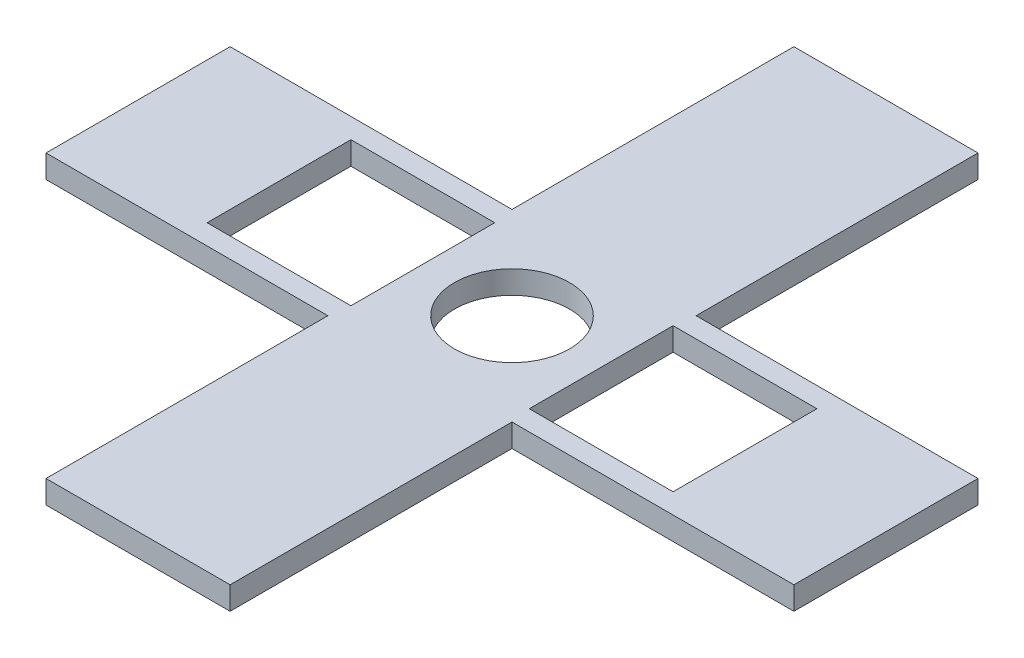
ISO-10303-21;
HEADER;
FILE_DESCRIPTION(('STEP AP214'),'2;1');
FILE_NAME('part.step','',(''),(''),'','','');
FILE_SCHEMA(('AUTOMOTIVE_DESIGN { 1 0 10303 214 1 1 1 1 }'));
ENDSEC;
DATA;
#1=APPLICATION_CONTEXT('core data for automotive mechanical design processes');
#2=APPLICATION_PROTOCOL_DEFINITION('international standard','automotive_design',2000,#1);
#3=PRODUCT_CONTEXT('',#1,'mechanical');
#4=PRODUCT('Part','Part','',(#3));
#5=PRODUCT_RELATED_PRODUCT_CATEGORY('part','',(#4));
#6=PRODUCT_DEFINITION_FORMATION('','',#4);
#7=PRODUCT_DEFINITION_CONTEXT('part definition',#1,'design');
#8=PRODUCT_DEFINITION('design','',#6,#7);
#9=PRODUCT_DEFINITION_SHAPE('','',#8);
#10=(LENGTH_UNIT() NAMED_UNIT(*) SI_UNIT(.MILLI.,.METRE.));
#11=(NAMED_UNIT(*) PLANE_ANGLE_UNIT() SI_UNIT($,.RADIAN.));
#12=(NAMED_UNIT(*) SI_UNIT($,.STERADIAN.) SOLID_ANGLE_UNIT());
#13=UNCERTAINTY_MEASURE_WITH_UNIT(LENGTH_MEASURE(1.E-05),#10,'distance_accuracy_value','');
#14=(GEOMETRIC_REPRESENTATION_CONTEXT(3) GLOBAL_UNCERTAINTY_ASSIGNED_CONTEXT((#13)) GLOBAL_UNIT_ASSIGNED_CONTEXT((#10,
#11,#12)) REPRESENTATION_CONTEXT('',''));
#15=CARTESIAN_POINT('',(0.,0.,0.));
#16=DIRECTION('',(0.,0.,1.));
#17=DIRECTION('',(1.,0.,0.));
#18=AXIS2_PLACEMENT_3D('',#15,#16,#17);
#19=CARTESIAN_POINT('',(0.,1.27,0.));
#20=DIRECTION('',(0.,1.,0.));
#21=DIRECTION('',(0.,0.,1.));
#22=AXIS2_PLACEMENT_3D('',#19,#20,#21);
#23=PLANE('',#22);
#24=DIRECTION('',(0.,0.,-1.));
#25=VECTOR('',#24,1.);
#26=CARTESIAN_POINT('',(20.6375,1.27,-5.08));
#27=LINE('',#26,#25);
#28=CARTESIAN_POINT('',(20.6375,1.27,5.08));
#29=VERTEX_POINT('',#28);
#30=CARTESIAN_POINT('',(20.6375,1.27,-5.08));
#31=VERTEX_POINT('',#30);
#32=EDGE_CURVE('E243',#29,#31,#27,.T.);
#33=ORIENTED_EDGE('',*,*,#32,.T.);
#34=DIRECTION('',(-1.,0.,0.));
#35=VECTOR('',#34,1.);
#36=CARTESIAN_POINT('',(5.08,1.27,-5.08));
#37=LINE('',#36,#35);
#38=CARTESIAN_POINT('',(5.08,1.27,-5.08));
#39=VERTEX_POINT('',#38);
#40=EDGE_CURVE('E246',#31,#39,#37,.T.);
#41=ORIENTED_EDGE('',*,*,#40,.T.);
#42=DIRECTION('',(0.,0.,-1.));
#43=VECTOR('',#42,1.);
#44=CARTESIAN_POINT('',(5.08,1.27,-20.6375));
#45=LINE('',#44,#43);
#46=CARTESIAN_POINT('',(5.08,1.27,-20.6375));
#47=VERTEX_POINT('',#46);
#48=EDGE_CURVE('E249',#39,#47,#45,.T.);
#49=ORIENTED_EDGE('',*,*,#48,.T.);
#50=DIRECTION('',(-1.,0.,0.));
#51=VECTOR('',#50,1.);
#52=CARTESIAN_POINT('',(-5.08,1.27,-20.6375));
#53=LINE('',#52,#51);
#54=CARTESIAN_POINT('',(-5.08,1.27,-20.6375));
#55=VERTEX_POINT('',#54);
#56=EDGE_CURVE('E251',#47,#55,#53,.T.);
#57=ORIENTED_EDGE('',*,*,#56,.T.);
#58=DIRECTION('',(0.,0.,1.));
#59=VECTOR('',#58,1.);
#60=CARTESIAN_POINT('',(-5.08,1.27,-20.6375));
#61=LINE('',#60,#59);
#62=CARTESIAN_POINT('',(-5.08,1.27,-5.08));
#63=VERTEX_POINT('',#62);
#64=EDGE_CURVE('E253',#55,#63,#61,.T.);
#65=ORIENTED_EDGE('',*,*,#64,.T.);
#66=DIRECTION('',(-1.,0.,0.));
#67=VECTOR('',#66,1.);
#68=CARTESIAN_POINT('',(-20.6375,1.27,-5.08));
#69=LINE('',#68,#67);
#70=CARTESIAN_POINT('',(-20.6375,1.27,-5.08));
#71=VERTEX_POINT('',#70);
#72=EDGE_CURVE('E255',#63,#71,#69,.T.);
#73=ORIENTED_EDGE('',*,*,#72,.T.);
#74=DIRECTION('',(0.,0.,1.));
#75=VECTOR('',#74,1.);
#76=CARTESIAN_POINT('',(-20.6375,1.27,-5.08));
#77=LINE('',#76,#75);
#78=CARTESIAN_POINT('',(-20.6375,1.27,5.08));
#79=VERTEX_POINT('',#78);
#80=EDGE_CURVE('E257',#71,#79,#77,.T.);
#81=ORIENTED_EDGE('',*,*,#80,.T.);
#82=DIRECTION('',(1.,0.,0.));
#83=VECTOR('',#82,1.);
#84=CARTESIAN_POINT('',(-20.6375,1.27,5.08));
#85=LINE('',#84,#83);
#86=CARTESIAN_POINT('',(-5.08,1.27,5.08));
#87=VERTEX_POINT('',#86);
#88=EDGE_CURVE('E259',#79,#87,#85,.T.);
#89=ORIENTED_EDGE('',*,*,#88,.T.);
#90=DIRECTION('',(0.,0.,1.));
#91=VECTOR('',#90,1.);
#92=CARTESIAN_POINT('',(-5.08,1.27,5.08));
#93=LINE('',#92,#91);
#94=CARTESIAN_POINT('',(-5.08,1.27,20.6375));
#95=VERTEX_POINT('',#94);
#96=EDGE_CURVE('E261',#87,#95,#93,.T.);
#97=ORIENTED_EDGE('',*,*,#96,.T.);
#98=DIRECTION('',(1.,0.,0.));
#99=VECTOR('',#98,1.);
#100=CARTESIAN_POINT('',(-5.08,1.27,20.6375));
#101=LINE('',#100,#99);
#102=CARTESIAN_POINT('',(5.08,1.27,20.6375));
#103=VERTEX_POINT('',#102);
#104=EDGE_CURVE('E263',#95,#103,#101,.T.);
#105=ORIENTED_EDGE('',*,*,#104,.T.);
#106=DIRECTION('',(0.,0.,-1.));
#107=VECTOR('',#106,1.);
#108=CARTESIAN_POINT('',(5.08,1.27,5.08));
#109=LINE('',#108,#107);
#110=CARTESIAN_POINT('',(5.08,1.27,5.08));
#111=VERTEX_POINT('',#110);
#112=EDGE_CURVE('E265',#103,#111,#109,.T.);
#113=ORIENTED_EDGE('',*,*,#112,.T.);
#114=DIRECTION('',(1.,0.,0.));
#115=VECTOR('',#114,1.);
#116=CARTESIAN_POINT('',(5.08,1.27,5.08));
#117=LINE('',#116,#115);
#118=EDGE_CURVE('E267',#111,#29,#117,.T.);
#119=ORIENTED_EDGE('',*,*,#118,.T.);
#120=EDGE_LOOP('',(#33,#41,#49,#57,#65,#73,#81,#89,#97,#105,#113,#119));
#121=FACE_BOUND('',#120,.T.);
#122=CARTESIAN_POINT('',(0.,1.27,0.));
#123=DIRECTION('',(0.,1.,0.));
#124=DIRECTION('',(0.,0.,1.));
#125=AXIS2_PLACEMENT_3D('',#122,#123,#124);
#126=CIRCLE('',#125,3.175);
#127=CARTESIAN_POINT('',(0.,1.27,3.175));
#128=VERTEX_POINT('',#127);
#129=EDGE_CURVE('E237',#128,#128,#126,.T.);
#130=ORIENTED_EDGE('',*,*,#129,.F.);
#131=EDGE_LOOP('',(#130));
#132=FACE_BOUND('',#131,.T.);
#133=DIRECTION('',(-1.,0.,0.));
#134=VECTOR('',#133,1.);
#135=CARTESIAN_POINT('',(-12.85875,1.27,-3.96875));
#136=LINE('',#135,#134);
#137=CARTESIAN_POINT('',(-4.92125,1.27,-3.96875));
#138=VERTEX_POINT('',#137);
#139=CARTESIAN_POINT('',(-12.85875,1.27,-3.96875));
#140=VERTEX_POINT('',#139);
#141=EDGE_CURVE('E208',#138,#140,#136,.T.);
#142=ORIENTED_EDGE('',*,*,#141,.F.);
#143=DIRECTION('',(0.,0.,-1.));
#144=VECTOR('',#143,1.);
#145=CARTESIAN_POINT('',(-4.92125,1.27,-3.96875));
#146=LINE('',#145,#144);
#147=CARTESIAN_POINT('',(-4.92125,1.27,3.96875));
#148=VERTEX_POINT('',#147);
#149=EDGE_CURVE('E206',#148,#138,#146,.T.);
#150=ORIENTED_EDGE('',*,*,#149,.F.);
#151=DIRECTION('',(1.,0.,0.));
#152=VECTOR('',#151,1.);
#153=CARTESIAN_POINT('',(-12.85875,1.27,3.96875));
#154=LINE('',#153,#152);
#155=CARTESIAN_POINT('',(-12.85875,1.27,3.96875));
#156=VERTEX_POINT('',#155);
#157=EDGE_CURVE('E214',#156,#148,#154,.T.);
#158=ORIENTED_EDGE('',*,*,#157,.F.);
#159=DIRECTION('',(0.,0.,1.));
#160=VECTOR('',#159,1.);
#161=CARTESIAN_POINT('',(-12.85875,1.27,-3.96875));
#162=LINE('',#161,#160);
#163=EDGE_CURVE('E211',#140,#156,#162,.T.);
#164=ORIENTED_EDGE('',*,*,#163,.F.);
#165=EDGE_LOOP('',(#142,#150,#158,#164));
#166=FACE_BOUND('',#165,.T.);
#167=DIRECTION('',(-1.,0.,0.));
#168=VECTOR('',#167,1.);
#169=CARTESIAN_POINT('',(4.92125,1.27,-3.96875));
#170=LINE('',#169,#168);
#171=CARTESIAN_POINT('',(12.85875,1.27,-3.96875));
#172=VERTEX_POINT('',#171);
#173=CARTESIAN_POINT('',(4.92125,1.27,-3.96875));
#174=VERTEX_POINT('',#173);
#175=EDGE_CURVE('E178',#172,#174,#170,.T.);
#176=ORIENTED_EDGE('',*,*,#175,.F.);
#177=DIRECTION('',(0.,0.,-1.));
#178=VECTOR('',#177,1.);
#179=CARTESIAN_POINT('',(12.85875,1.27,-3.96875));
#180=LINE('',#179,#178);
#181=CARTESIAN_POINT('',(12.85875,1.27,3.96875));
#182=VERTEX_POINT('',#181);
#183=EDGE_CURVE('E170',#182,#172,#180,.T.);
#184=ORIENTED_EDGE('',*,*,#183,.F.);
#185=DIRECTION('',(1.,0.,0.));
#186=VECTOR('',#185,1.);
#187=CARTESIAN_POINT('',(4.92125,1.27,3.96875));
#188=LINE('',#187,#186);
#189=CARTESIAN_POINT('',(4.92125,1.27,3.96875));
#190=VERTEX_POINT('',#189);
#191=EDGE_CURVE('E192',#190,#182,#188,.T.);
#192=ORIENTED_EDGE('',*,*,#191,.F.);
#193=DIRECTION('',(0.,0.,1.));
#194=VECTOR('',#193,1.);
#195=CARTESIAN_POINT('',(4.92125,1.27,-3.96875));
#196=LINE('',#195,#194);
#197=EDGE_CURVE('E190',#174,#190,#196,.T.);
#198=ORIENTED_EDGE('',*,*,#197,.F.);
#199=EDGE_LOOP('',(#176,#184,#192,#198));
#200=FACE_BOUND('',#199,.T.);
#201=ADVANCED_FACE('F33',(#121,#132,#166,#200),#23,.T.);
#202=CARTESIAN_POINT('',(0.,0.,0.));
#203=DIRECTION('',(0.,1.,0.));
#204=DIRECTION('',(0.,0.,1.));
#205=AXIS2_PLACEMENT_3D('',#202,#203,#204);
#206=PLANE('',#205);
#207=DIRECTION('',(0.,0.,-1.));
#208=VECTOR('',#207,1.);
#209=CARTESIAN_POINT('',(-4.92125,0.,-3.96875));
#210=LINE('',#209,#208);
#211=CARTESIAN_POINT('',(-4.92125,0.,3.96875));
#212=VERTEX_POINT('',#211);
#213=CARTESIAN_POINT('',(-4.92125,0.,-3.96875));
#214=VERTEX_POINT('',#213);
#215=EDGE_CURVE('E186',#212,#214,#210,.T.);
#216=ORIENTED_EDGE('',*,*,#215,.T.);
#217=DIRECTION('',(-1.,0.,0.));
#218=VECTOR('',#217,1.);
#219=CARTESIAN_POINT('',(-12.85875,0.,-3.96875));
#220=LINE('',#219,#218);
#221=CARTESIAN_POINT('',(-12.85875,0.,-3.96875));
#222=VERTEX_POINT('',#221);
#223=EDGE_CURVE('E219',#214,#222,#220,.T.);
#224=ORIENTED_EDGE('',*,*,#223,.T.);
#225=DIRECTION('',(0.,0.,1.));
#226=VECTOR('',#225,1.);
#227=CARTESIAN_POINT('',(-12.85875,0.,-3.96875));
#228=LINE('',#227,#226);
#229=CARTESIAN_POINT('',(-12.85875,0.,3.96875));
#230=VERTEX_POINT('',#229);
#231=EDGE_CURVE('E222',#222,#230,#228,.T.);
#232=ORIENTED_EDGE('',*,*,#231,.T.);
#233=DIRECTION('',(1.,0.,0.));
#234=VECTOR('',#233,1.);
#235=CARTESIAN_POINT('',(-12.85875,0.,3.96875));
#236=LINE('',#235,#234);
#237=EDGE_CURVE('E209',#230,#212,#236,.T.);
#238=ORIENTED_EDGE('',*,*,#237,.T.);
#239=EDGE_LOOP('',(#216,#224,#232,#238));
#240=FACE_BOUND('',#239,.T.);
#241=DIRECTION('',(0.,0.,-1.));
#242=VECTOR('',#241,1.);
#243=CARTESIAN_POINT('',(20.6375,0.,-5.08));
#244=LINE('',#243,#242);
#245=CARTESIAN_POINT('',(20.6375,0.,5.08));
#246=VERTEX_POINT('',#245);
#247=CARTESIAN_POINT('',(20.6375,0.,-5.08));
#248=VERTEX_POINT('',#247);
#249=EDGE_CURVE('E240',#246,#248,#244,.T.);
#250=ORIENTED_EDGE('',*,*,#249,.F.);
#251=DIRECTION('',(1.,0.,0.));
#252=VECTOR('',#251,1.);
#253=CARTESIAN_POINT('',(5.08,0.,5.08));
#254=LINE('',#253,#252);
#255=CARTESIAN_POINT('',(5.08,0.,5.08));
#256=VERTEX_POINT('',#255);
#257=EDGE_CURVE('E247',#256,#246,#254,.T.);
#258=ORIENTED_EDGE('',*,*,#257,.F.);
#259=DIRECTION('',(0.,0.,-1.));
#260=VECTOR('',#259,1.);
#261=CARTESIAN_POINT('',(5.08,0.,5.08));
#262=LINE('',#261,#260);
#263=CARTESIAN_POINT('',(5.08,0.,20.6375));
#264=VERTEX_POINT('',#263);
#265=EDGE_CURVE('E290',#264,#256,#262,.T.);
#266=ORIENTED_EDGE('',*,*,#265,.F.);
#267=DIRECTION('',(1.,0.,0.));
#268=VECTOR('',#267,1.);
#269=CARTESIAN_POINT('',(-5.08,0.,20.6375));
#270=LINE('',#269,#268);
#271=CARTESIAN_POINT('',(-5.08,0.,20.6375));
#272=VERTEX_POINT('',#271);
#273=EDGE_CURVE('E288',#272,#264,#270,.T.);
#274=ORIENTED_EDGE('',*,*,#273,.F.);
#275=DIRECTION('',(0.,0.,1.));
#276=VECTOR('',#275,1.);
#277=CARTESIAN_POINT('',(-5.08,0.,5.08));
#278=LINE('',#277,#276);
#279=CARTESIAN_POINT('',(-5.08,0.,5.08));
#280=VERTEX_POINT('',#279);
#281=EDGE_CURVE('E286',#280,#272,#278,.T.);
#282=ORIENTED_EDGE('',*,*,#281,.F.);
#283=DIRECTION('',(1.,0.,0.));
#284=VECTOR('',#283,1.);
#285=CARTESIAN_POINT('',(-20.6375,0.,5.08));
#286=LINE('',#285,#284);
#287=CARTESIAN_POINT('',(-20.6375,0.,5.08));
#288=VERTEX_POINT('',#287);
#289=EDGE_CURVE('E284',#288,#280,#286,.T.);
#290=ORIENTED_EDGE('',*,*,#289,.F.);
#291=DIRECTION('',(0.,0.,1.));
#292=VECTOR('',#291,1.);
#293=CARTESIAN_POINT('',(-20.6375,0.,-5.08));
#294=LINE('',#293,#292);
#295=CARTESIAN_POINT('',(-20.6375,0.,-5.08));
#296=VERTEX_POINT('',#295);
#297=EDGE_CURVE('E282',#296,#288,#294,.T.);
#298=ORIENTED_EDGE('',*,*,#297,.F.);
#299=DIRECTION('',(-1.,0.,0.));
#300=VECTOR('',#299,1.);
#301=CARTESIAN_POINT('',(-20.6375,0.,-5.08));
#302=LINE('',#301,#300);
#303=CARTESIAN_POINT('',(-5.08,0.,-5.08));
#304=VERTEX_POINT('',#303);
#305=EDGE_CURVE('E280',#304,#296,#302,.T.);
#306=ORIENTED_EDGE('',*,*,#305,.F.);
#307=DIRECTION('',(0.,0.,1.));
#308=VECTOR('',#307,1.);
#309=CARTESIAN_POINT('',(-5.08,0.,-20.6375));
#310=LINE('',#309,#308);
#311=CARTESIAN_POINT('',(-5.08,0.,-20.6375));
#312=VERTEX_POINT('',#311);
#313=EDGE_CURVE('E278',#312,#304,#310,.T.);
#314=ORIENTED_EDGE('',*,*,#313,.F.);
#315=DIRECTION('',(-1.,0.,0.));
#316=VECTOR('',#315,1.);
#317=CARTESIAN_POINT('',(-5.08,0.,-20.6375));
#318=LINE('',#317,#316);
#319=CARTESIAN_POINT('',(5.08,0.,-20.6375));
#320=VERTEX_POINT('',#319);
#321=EDGE_CURVE('E276',#320,#312,#318,.T.);
#322=ORIENTED_EDGE('',*,*,#321,.F.);
#323=DIRECTION('',(0.,0.,-1.));
#324=VECTOR('',#323,1.);
#325=CARTESIAN_POINT('',(5.08,0.,-20.6375));
#326=LINE('',#325,#324);
#327=CARTESIAN_POINT('',(5.08,0.,-5.08));
#328=VERTEX_POINT('',#327);
#329=EDGE_CURVE('E274',#328,#320,#326,.T.);
#330=ORIENTED_EDGE('',*,*,#329,.F.);
#331=DIRECTION('',(-1.,0.,0.));
#332=VECTOR('',#331,1.);
#333=CARTESIAN_POINT('',(5.08,0.,-5.08));
#334=LINE('',#333,#332);
#335=EDGE_CURVE('E272',#248,#328,#334,.T.);
#336=ORIENTED_EDGE('',*,*,#335,.F.);
#337=EDGE_LOOP('',(#250,#258,#266,#274,#282,#290,#298,#306,#314,#322,#330,#336));
#338=FACE_BOUND('',#337,.T.);
#339=CARTESIAN_POINT('',(0.,0.,0.));
#340=DIRECTION('',(0.,1.,0.));
#341=DIRECTION('',(0.,0.,1.));
#342=AXIS2_PLACEMENT_3D('',#339,#340,#341);
#343=CIRCLE('',#342,3.175);
#344=CARTESIAN_POINT('',(0.,0.,3.175));
#345=VERTEX_POINT('',#344);
#346=EDGE_CURVE('E236',#345,#345,#343,.T.);
#347=ORIENTED_EDGE('',*,*,#346,.T.);
#348=EDGE_LOOP('',(#347));
#349=FACE_BOUND('',#348,.T.);
#350=DIRECTION('',(0.,0.,-1.));
#351=VECTOR('',#350,1.);
#352=CARTESIAN_POINT('',(12.85875,0.,-3.96875));
#353=LINE('',#352,#351);
#354=CARTESIAN_POINT('',(12.85875,0.,3.96875));
#355=VERTEX_POINT('',#354);
#356=CARTESIAN_POINT('',(12.85875,0.,-3.96875));
#357=VERTEX_POINT('',#356);
#358=EDGE_CURVE('E56',#355,#357,#353,.T.);
#359=ORIENTED_EDGE('',*,*,#358,.T.);
#360=DIRECTION('',(-1.,0.,0.));
#361=VECTOR('',#360,1.);
#362=CARTESIAN_POINT('',(4.92125,0.,-3.96875));
#363=LINE('',#362,#361);
#364=CARTESIAN_POINT('',(4.92125,0.,-3.96875));
#365=VERTEX_POINT('',#364);
#366=EDGE_CURVE('E185',#357,#365,#363,.T.);
#367=ORIENTED_EDGE('',*,*,#366,.T.);
#368=DIRECTION('',(0.,0.,1.));
#369=VECTOR('',#368,1.);
#370=CARTESIAN_POINT('',(4.92125,0.,-3.96875));
#371=LINE('',#370,#369);
#372=CARTESIAN_POINT('',(4.92125,0.,3.96875));
#373=VERTEX_POINT('',#372);
#374=EDGE_CURVE('E198',#365,#373,#371,.T.);
#375=ORIENTED_EDGE('',*,*,#374,.T.);
#376=DIRECTION('',(1.,0.,0.));
#377=VECTOR('',#376,1.);
#378=CARTESIAN_POINT('',(4.92125,0.,3.96875));
#379=LINE('',#378,#377);
#380=EDGE_CURVE('E179',#373,#355,#379,.T.);
#381=ORIENTED_EDGE('',*,*,#380,.T.);
#382=EDGE_LOOP('',(#359,#367,#375,#381));
#383=FACE_BOUND('',#382,.T.);
#384=ADVANCED_FACE('F332',(#240,#338,#349,#383),#206,.F.);
#385=CARTESIAN_POINT('',(20.6375,1.27,-5.08));
#386=DIRECTION('',(-1.,0.,0.));
#387=DIRECTION('',(0.,0.,1.));
#388=AXIS2_PLACEMENT_3D('',#385,#386,#387);
#389=PLANE('',#388);
#390=ORIENTED_EDGE('',*,*,#249,.T.);
#391=DIRECTION('',(0.,-1.,0.));
#392=VECTOR('',#391,1.);
#393=CARTESIAN_POINT('',(20.6375,1.27,-5.08));
#394=LINE('',#393,#392);
#395=EDGE_CURVE('E11',#31,#248,#394,.T.);
#396=ORIENTED_EDGE('',*,*,#395,.F.);
#397=ORIENTED_EDGE('',*,*,#32,.F.);
#398=DIRECTION('',(0.,-1.,0.));
#399=VECTOR('',#398,1.);
#400=CARTESIAN_POINT('',(20.6375,1.27,5.08));
#401=LINE('',#400,#399);
#402=EDGE_CURVE('E269',#29,#246,#401,.T.);
#403=ORIENTED_EDGE('',*,*,#402,.T.);
#404=EDGE_LOOP('',(#390,#396,#397,#403));
#405=FACE_BOUND('',#404,.T.);
#406=ADVANCED_FACE('F35',(#405),#389,.F.);
#407=CARTESIAN_POINT('',(5.08,1.27,-5.08));
#408=DIRECTION('',(0.,0.,1.));
#409=DIRECTION('',(1.,0.,0.));
#410=AXIS2_PLACEMENT_3D('',#407,#408,#409);
#411=PLANE('',#410);
#412=ORIENTED_EDGE('',*,*,#335,.T.);
#413=DIRECTION('',(0.,-1.,0.));
#414=VECTOR('',#413,1.);
#415=CARTESIAN_POINT('',(5.08,1.27,-5.08));
#416=LINE('',#415,#414);
#417=EDGE_CURVE('E41',#39,#328,#416,.T.);
#418=ORIENTED_EDGE('',*,*,#417,.F.);
#419=ORIENTED_EDGE('',*,*,#40,.F.);
#420=ORIENTED_EDGE('',*,*,#395,.T.);
#421=EDGE_LOOP('',(#412,#418,#419,#420));
#422=FACE_BOUND('',#421,.T.);
#423=ADVANCED_FACE('F350',(#422),#411,.F.);
#424=CARTESIAN_POINT('',(5.08,1.27,-20.6375));
#425=DIRECTION('',(-1.,0.,0.));
#426=DIRECTION('',(0.,0.,1.));
#427=AXIS2_PLACEMENT_3D('',#424,#425,#426);
#428=PLANE('',#427);
#429=ORIENTED_EDGE('',*,*,#329,.T.);
#430=DIRECTION('',(0.,-1.,0.));
#431=VECTOR('',#430,1.);
#432=CARTESIAN_POINT('',(5.08,1.27,-20.6375));
#433=LINE('',#432,#431);
#434=EDGE_CURVE('E319',#47,#320,#433,.T.);
#435=ORIENTED_EDGE('',*,*,#434,.F.);
#436=ORIENTED_EDGE('',*,*,#48,.F.);
#437=ORIENTED_EDGE('',*,*,#417,.T.);
#438=EDGE_LOOP('',(#429,#435,#436,#437));
#439=FACE_BOUND('',#438,.T.);
#440=ADVANCED_FACE('F326',(#439),#428,.F.);
#441=CARTESIAN_POINT('',(-5.08,1.27,-20.6375));
#442=DIRECTION('',(0.,0.,1.));
#443=DIRECTION('',(1.,0.,0.));
#444=AXIS2_PLACEMENT_3D('',#441,#442,#443);
#445=PLANE('',#444);
#446=ORIENTED_EDGE('',*,*,#321,.T.);
#447=DIRECTION('',(0.,-1.,0.));
#448=VECTOR('',#447,1.);
#449=CARTESIAN_POINT('',(-5.08,1.27,-20.6375));
#450=LINE('',#449,#448);
#451=EDGE_CURVE('E316',#55,#312,#450,.T.);
#452=ORIENTED_EDGE('',*,*,#451,.F.);
#453=ORIENTED_EDGE('',*,*,#56,.F.);
#454=ORIENTED_EDGE('',*,*,#434,.T.);
#455=EDGE_LOOP('',(#446,#452,#453,#454));
#456=FACE_BOUND('',#455,.T.);
#457=ADVANCED_FACE('F338',(#456),#445,.F.);
#458=CARTESIAN_POINT('',(-5.08,1.27,-20.6375));
#459=DIRECTION('',(1.,0.,0.));
#460=DIRECTION('',(0.,0.,-1.));
#461=AXIS2_PLACEMENT_3D('',#458,#459,#460);
#462=PLANE('',#461);
#463=ORIENTED_EDGE('',*,*,#313,.T.);
#464=DIRECTION('',(0.,-1.,0.));
#465=VECTOR('',#464,1.);
#466=CARTESIAN_POINT('',(-5.08,1.27,-5.08));
#467=LINE('',#466,#465);
#468=EDGE_CURVE('E313',#63,#304,#467,.T.);
#469=ORIENTED_EDGE('',*,*,#468,.F.);
#470=ORIENTED_EDGE('',*,*,#64,.F.);
#471=ORIENTED_EDGE('',*,*,#451,.T.);
#472=EDGE_LOOP('',(#463,#469,#470,#471));
#473=FACE_BOUND('',#472,.T.);
#474=ADVANCED_FACE('F342',(#473),#462,.F.);
#475=CARTESIAN_POINT('',(-20.6375,1.27,-5.08));
#476=DIRECTION('',(0.,0.,1.));
#477=DIRECTION('',(1.,0.,0.));
#478=AXIS2_PLACEMENT_3D('',#475,#476,#477);
#479=PLANE('',#478);
#480=ORIENTED_EDGE('',*,*,#305,.T.);
#481=DIRECTION('',(0.,-1.,0.));
#482=VECTOR('',#481,1.);
#483=CARTESIAN_POINT('',(-20.6375,1.27,-5.08));
#484=LINE('',#483,#482);
#485=EDGE_CURVE('E310',#71,#296,#484,.T.);
#486=ORIENTED_EDGE('',*,*,#485,.F.);
#487=ORIENTED_EDGE('',*,*,#72,.F.);
#488=ORIENTED_EDGE('',*,*,#468,.T.);
#489=EDGE_LOOP('',(#480,#486,#487,#488));
#490=FACE_BOUND('',#489,.T.);
#491=ADVANCED_FACE('F383',(#490),#479,.F.);
#492=CARTESIAN_POINT('',(-20.6375,1.27,-5.08));
#493=DIRECTION('',(1.,0.,0.));
#494=DIRECTION('',(0.,0.,-1.));
#495=AXIS2_PLACEMENT_3D('',#492,#493,#494);
#496=PLANE('',#495);
#497=ORIENTED_EDGE('',*,*,#297,.T.);
#498=DIRECTION('',(0.,-1.,0.));
#499=VECTOR('',#498,1.);
#500=CARTESIAN_POINT('',(-20.6375,1.27,5.08));
#501=LINE('',#500,#499);
#502=EDGE_CURVE('E307',#79,#288,#501,.T.);
#503=ORIENTED_EDGE('',*,*,#502,.F.);
#504=ORIENTED_EDGE('',*,*,#80,.F.);
#505=ORIENTED_EDGE('',*,*,#485,.T.);
#506=EDGE_LOOP('',(#497,#503,#504,#505));
#507=FACE_BOUND('',#506,.T.);
#508=ADVANCED_FACE('F381',(#507),#496,.F.);
#509=CARTESIAN_POINT('',(-20.6375,1.27,5.08));
#510=DIRECTION('',(0.,0.,-1.));
#511=DIRECTION('',(-1.,0.,0.));
#512=AXIS2_PLACEMENT_3D('',#509,#510,#511);
#513=PLANE('',#512);
#514=ORIENTED_EDGE('',*,*,#289,.T.);
#515=DIRECTION('',(0.,-1.,0.));
#516=VECTOR('',#515,1.);
#517=CARTESIAN_POINT('',(-5.08,1.27,5.08));
#518=LINE('',#517,#516);
#519=EDGE_CURVE('E304',#87,#280,#518,.T.);
#520=ORIENTED_EDGE('',*,*,#519,.F.);
#521=ORIENTED_EDGE('',*,*,#88,.F.);
#522=ORIENTED_EDGE('',*,*,#502,.T.);
#523=EDGE_LOOP('',(#514,#520,#521,#522));
#524=FACE_BOUND('',#523,.T.);
#525=ADVANCED_FACE('F377',(#524),#513,.F.);
#526=CARTESIAN_POINT('',(-5.08,1.27,5.08));
#527=DIRECTION('',(1.,0.,0.));
#528=DIRECTION('',(0.,0.,-1.));
#529=AXIS2_PLACEMENT_3D('',#526,#527,#528);
#530=PLANE('',#529);
#531=ORIENTED_EDGE('',*,*,#281,.T.);
#532=DIRECTION('',(0.,-1.,0.));
#533=VECTOR('',#532,1.);
#534=CARTESIAN_POINT('',(-5.08,1.27,20.6375));
#535=LINE('',#534,#533);
#536=EDGE_CURVE('E301',#95,#272,#535,.T.);
#537=ORIENTED_EDGE('',*,*,#536,.F.);
#538=ORIENTED_EDGE('',*,*,#96,.F.);
#539=ORIENTED_EDGE('',*,*,#519,.T.);
#540=EDGE_LOOP('',(#531,#537,#538,#539));
#541=FACE_BOUND('',#540,.T.);
#542=ADVANCED_FACE('F372',(#541),#530,.F.);
#543=CARTESIAN_POINT('',(-5.08,1.27,20.6375));
#544=DIRECTION('',(0.,0.,-1.));
#545=DIRECTION('',(-1.,0.,0.));
#546=AXIS2_PLACEMENT_3D('',#543,#544,#545);
#547=PLANE('',#546);
#548=ORIENTED_EDGE('',*,*,#273,.T.);
#549=DIRECTION('',(0.,-1.,0.));
#550=VECTOR('',#549,1.);
#551=CARTESIAN_POINT('',(5.08,1.27,20.6375));
#552=LINE('',#551,#550);
#553=EDGE_CURVE('E298',#103,#264,#552,.T.);
#554=ORIENTED_EDGE('',*,*,#553,.F.);
#555=ORIENTED_EDGE('',*,*,#104,.F.);
#556=ORIENTED_EDGE('',*,*,#536,.T.);
#557=EDGE_LOOP('',(#548,#554,#555,#556));
#558=FACE_BOUND('',#557,.T.);
#559=ADVANCED_FACE('F366',(#558),#547,.F.);
#560=CARTESIAN_POINT('',(5.08,1.27,5.08));
#561=DIRECTION('',(-1.,0.,0.));
#562=DIRECTION('',(0.,0.,1.));
#563=AXIS2_PLACEMENT_3D('',#560,#561,#562);
#564=PLANE('',#563);
#565=ORIENTED_EDGE('',*,*,#265,.T.);
#566=DIRECTION('',(0.,-1.,0.));
#567=VECTOR('',#566,1.);
#568=CARTESIAN_POINT('',(5.08,1.27,5.08));
#569=LINE('',#568,#567);
#570=EDGE_CURVE('E295',#111,#256,#569,.T.);
#571=ORIENTED_EDGE('',*,*,#570,.F.);
#572=ORIENTED_EDGE('',*,*,#112,.F.);
#573=ORIENTED_EDGE('',*,*,#553,.T.);
#574=EDGE_LOOP('',(#565,#571,#572,#573));
#575=FACE_BOUND('',#574,.T.);
#576=ADVANCED_FACE('F362',(#575),#564,.F.);
#577=CARTESIAN_POINT('',(5.08,1.27,5.08));
#578=DIRECTION('',(0.,0.,-1.));
#579=DIRECTION('',(-1.,0.,0.));
#580=AXIS2_PLACEMENT_3D('',#577,#578,#579);
#581=PLANE('',#580);
#582=ORIENTED_EDGE('',*,*,#257,.T.);
#583=ORIENTED_EDGE('',*,*,#402,.F.);
#584=ORIENTED_EDGE('',*,*,#118,.F.);
#585=ORIENTED_EDGE('',*,*,#570,.T.);
#586=EDGE_LOOP('',(#582,#583,#584,#585));
#587=FACE_BOUND('',#586,.T.);
#588=ADVANCED_FACE('F357',(#587),#581,.F.);
#589=CARTESIAN_POINT('',(0.,1.27,0.));
#590=DIRECTION('',(0.,-1.,0.));
#591=DIRECTION('',(0.,0.,-1.));
#592=AXIS2_PLACEMENT_3D('',#589,#590,#591);
#593=CYLINDRICAL_SURFACE('',#592,3.175);
#594=ORIENTED_EDGE('',*,*,#129,.T.);
#595=EDGE_LOOP('',(#594));
#596=FACE_BOUND('',#595,.T.);
#597=ORIENTED_EDGE('',*,*,#346,.F.);
#598=EDGE_LOOP('',(#597));
#599=FACE_BOUND('',#598,.T.);
#600=ADVANCED_FACE('F400',(#596,#599),#593,.F.);
#601=CARTESIAN_POINT('',(-4.92125,1.27,-3.96875));
#602=DIRECTION('',(-1.,0.,0.));
#603=DIRECTION('',(0.,0.,1.));
#604=AXIS2_PLACEMENT_3D('',#601,#602,#603);
#605=PLANE('',#604);
#606=ORIENTED_EDGE('',*,*,#215,.F.);
#607=DIRECTION('',(0.,-1.,0.));
#608=VECTOR('',#607,1.);
#609=CARTESIAN_POINT('',(-4.92125,1.27,3.96875));
#610=LINE('',#609,#608);
#611=EDGE_CURVE('E216',#148,#212,#610,.T.);
#612=ORIENTED_EDGE('',*,*,#611,.F.);
#613=ORIENTED_EDGE('',*,*,#149,.T.);
#614=DIRECTION('',(0.,-1.,0.));
#615=VECTOR('',#614,1.);
#616=CARTESIAN_POINT('',(-4.92125,1.27,-3.96875));
#617=LINE('',#616,#615);
#618=EDGE_CURVE('E233',#138,#214,#617,.T.);
#619=ORIENTED_EDGE('',*,*,#618,.T.);
#620=EDGE_LOOP('',(#606,#612,#613,#619));
#621=FACE_BOUND('',#620,.T.);
#622=ADVANCED_FACE('F438',(#621),#605,.T.);
#623=CARTESIAN_POINT('',(-12.85875,1.27,-3.96875));
#624=DIRECTION('',(0.,0.,1.));
#625=DIRECTION('',(1.,0.,0.));
#626=AXIS2_PLACEMENT_3D('',#623,#624,#625);
#627=PLANE('',#626);
#628=ORIENTED_EDGE('',*,*,#223,.F.);
#629=ORIENTED_EDGE('',*,*,#618,.F.);
#630=ORIENTED_EDGE('',*,*,#141,.T.);
#631=DIRECTION('',(0.,-1.,0.));
#632=VECTOR('',#631,1.);
#633=CARTESIAN_POINT('',(-12.85875,1.27,-3.96875));
#634=LINE('',#633,#632);
#635=EDGE_CURVE('E231',#140,#222,#634,.T.);
#636=ORIENTED_EDGE('',*,*,#635,.T.);
#637=EDGE_LOOP('',(#628,#629,#630,#636));
#638=FACE_BOUND('',#637,.T.);
#639=ADVANCED_FACE('F445',(#638),#627,.T.);
#640=CARTESIAN_POINT('',(-12.85875,1.27,-3.96875));
#641=DIRECTION('',(1.,0.,0.));
#642=DIRECTION('',(0.,0.,-1.));
#643=AXIS2_PLACEMENT_3D('',#640,#641,#642);
#644=PLANE('',#643);
#645=ORIENTED_EDGE('',*,*,#231,.F.);
#646=ORIENTED_EDGE('',*,*,#635,.F.);
#647=ORIENTED_EDGE('',*,*,#163,.T.);
#648=DIRECTION('',(0.,-1.,0.));
#649=VECTOR('',#648,1.);
#650=CARTESIAN_POINT('',(-12.85875,1.27,3.96875));
#651=LINE('',#650,#649);
#652=EDGE_CURVE('E229',#156,#230,#651,.T.);
#653=ORIENTED_EDGE('',*,*,#652,.T.);
#654=EDGE_LOOP('',(#645,#646,#647,#653));
#655=FACE_BOUND('',#654,.T.);
#656=ADVANCED_FACE('F452',(#655),#644,.T.);
#657=CARTESIAN_POINT('',(-12.85875,1.27,3.96875));
#658=DIRECTION('',(0.,0.,-1.));
#659=DIRECTION('',(-1.,0.,0.));
#660=AXIS2_PLACEMENT_3D('',#657,#658,#659);
#661=PLANE('',#660);
#662=ORIENTED_EDGE('',*,*,#237,.F.);
#663=ORIENTED_EDGE('',*,*,#652,.F.);
#664=ORIENTED_EDGE('',*,*,#157,.T.);
#665=ORIENTED_EDGE('',*,*,#611,.T.);
#666=EDGE_LOOP('',(#662,#663,#664,#665));
#667=FACE_BOUND('',#666,.T.);
#668=ADVANCED_FACE('F460',(#667),#661,.T.);
#669=CARTESIAN_POINT('',(12.85875,1.27,-3.96875));
#670=DIRECTION('',(-1.,0.,0.));
#671=DIRECTION('',(0.,0.,1.));
#672=AXIS2_PLACEMENT_3D('',#669,#670,#671);
#673=PLANE('',#672);
#674=ORIENTED_EDGE('',*,*,#358,.F.);
#675=DIRECTION('',(0.,-1.,0.));
#676=VECTOR('',#675,1.);
#677=CARTESIAN_POINT('',(12.85875,1.27,3.96875));
#678=LINE('',#677,#676);
#679=EDGE_CURVE('E174',#182,#355,#678,.T.);
#680=ORIENTED_EDGE('',*,*,#679,.F.);
#681=ORIENTED_EDGE('',*,*,#183,.T.);
#682=DIRECTION('',(0.,-1.,0.));
#683=VECTOR('',#682,1.);
#684=CARTESIAN_POINT('',(12.85875,1.27,-3.96875));
#685=LINE('',#684,#683);
#686=EDGE_CURVE('E173',#172,#357,#685,.T.);
#687=ORIENTED_EDGE('',*,*,#686,.T.);
#688=EDGE_LOOP('',(#674,#680,#681,#687));
#689=FACE_BOUND('',#688,.T.);
#690=ADVANCED_FACE('F172',(#689),#673,.T.);
#691=CARTESIAN_POINT('',(4.92125,1.27,-3.96875));
#692=DIRECTION('',(0.,0.,1.));
#693=DIRECTION('',(1.,0.,0.));
#694=AXIS2_PLACEMENT_3D('',#691,#692,#693);
#695=PLANE('',#694);
#696=ORIENTED_EDGE('',*,*,#366,.F.);
#697=ORIENTED_EDGE('',*,*,#686,.F.);
#698=ORIENTED_EDGE('',*,*,#175,.T.);
#699=DIRECTION('',(0.,-1.,0.));
#700=VECTOR('',#699,1.);
#701=CARTESIAN_POINT('',(4.92125,1.27,-3.96875));
#702=LINE('',#701,#700);
#703=EDGE_CURVE('E187',#174,#365,#702,.T.);
#704=ORIENTED_EDGE('',*,*,#703,.T.);
#705=EDGE_LOOP('',(#696,#697,#698,#704));
#706=FACE_BOUND('',#705,.T.);
#707=ADVANCED_FACE('F182',(#706),#695,.T.);
#708=CARTESIAN_POINT('',(4.92125,1.27,-3.96875));
#709=DIRECTION('',(1.,0.,0.));
#710=DIRECTION('',(0.,0.,-1.));
#711=AXIS2_PLACEMENT_3D('',#708,#709,#710);
#712=PLANE('',#711);
#713=ORIENTED_EDGE('',*,*,#374,.F.);
#714=ORIENTED_EDGE('',*,*,#703,.F.);
#715=ORIENTED_EDGE('',*,*,#197,.T.);
#716=DIRECTION('',(0.,-1.,0.));
#717=VECTOR('',#716,1.);
#718=CARTESIAN_POINT('',(4.92125,1.27,3.96875));
#719=LINE('',#718,#717);
#720=EDGE_CURVE('E48',#190,#373,#719,.T.);
#721=ORIENTED_EDGE('',*,*,#720,.T.);
#722=EDGE_LOOP('',(#713,#714,#715,#721));
#723=FACE_BOUND('',#722,.T.);
#724=ADVANCED_FACE('F481',(#723),#712,.T.);
#725=CARTESIAN_POINT('',(4.92125,1.27,3.96875));
#726=DIRECTION('',(0.,0.,-1.));
#727=DIRECTION('',(-1.,0.,0.));
#728=AXIS2_PLACEMENT_3D('',#725,#726,#727);
#729=PLANE('',#728);
#730=ORIENTED_EDGE('',*,*,#380,.F.);
#731=ORIENTED_EDGE('',*,*,#720,.F.);
#732=ORIENTED_EDGE('',*,*,#191,.T.);
#733=ORIENTED_EDGE('',*,*,#679,.T.);
#734=EDGE_LOOP('',(#730,#731,#732,#733));
#735=FACE_BOUND('',#734,.T.);
#736=ADVANCED_FACE('F488',(#735),#729,.T.);
#737=CLOSED_SHELL('',(#201,#384,#406,#423,#440,#457,#474,#491,#508,#525,#542,#559,#576,#588,
#600,#622,#639,#656,#668,#690,#707,#724,#736));
#738=MANIFOLD_SOLID_BREP('B2',#737);
#739=ADVANCED_BREP_SHAPE_REPRESENTATION('',(#18,#738),#14);
#740=SHAPE_DEFINITION_REPRESENTATION(#9,#739);
ENDSEC;
END-ISO-10303-21;
